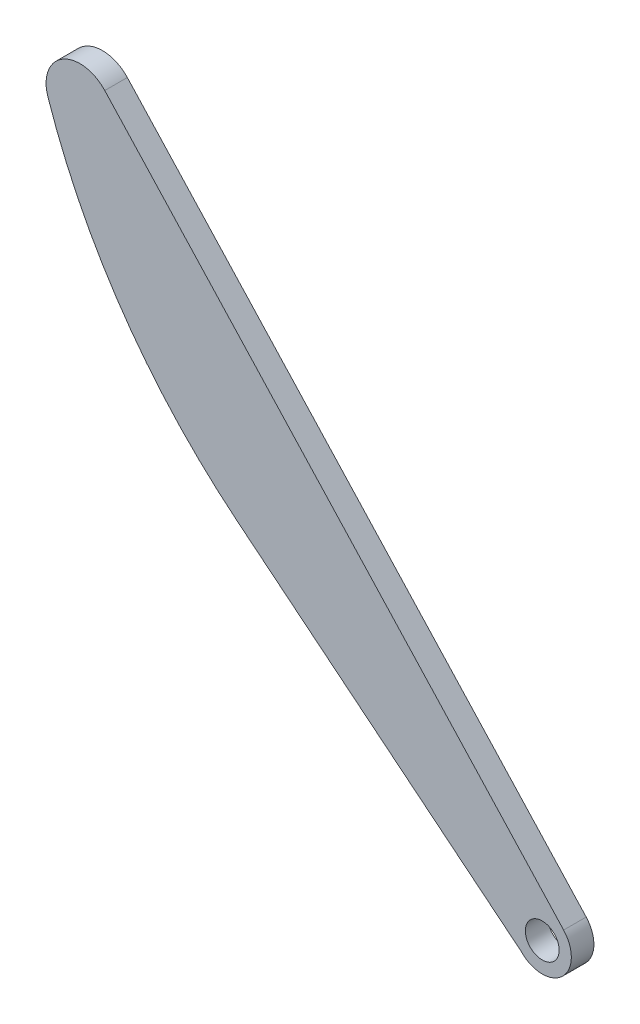
ISO-10303-21;
HEADER;
FILE_DESCRIPTION(('STEP AP214'),'2;1');
FILE_NAME('part.step','',(''),(''),'','','');
FILE_SCHEMA(('AUTOMOTIVE_DESIGN { 1 0 10303 214 1 1 1 1 }'));
ENDSEC;
DATA;
#1=APPLICATION_CONTEXT('core data for automotive mechanical design processes');
#2=APPLICATION_PROTOCOL_DEFINITION('international standard','automotive_design',2000,#1);
#3=PRODUCT_CONTEXT('',#1,'mechanical');
#4=PRODUCT('Part','Part','',(#3));
#5=PRODUCT_RELATED_PRODUCT_CATEGORY('part','',(#4));
#6=PRODUCT_DEFINITION_FORMATION('','',#4);
#7=PRODUCT_DEFINITION_CONTEXT('part definition',#1,'design');
#8=PRODUCT_DEFINITION('design','',#6,#7);
#9=PRODUCT_DEFINITION_SHAPE('','',#8);
#10=(LENGTH_UNIT() NAMED_UNIT(*) SI_UNIT(.MILLI.,.METRE.));
#11=(NAMED_UNIT(*) PLANE_ANGLE_UNIT() SI_UNIT($,.RADIAN.));
#12=(NAMED_UNIT(*) SI_UNIT($,.STERADIAN.) SOLID_ANGLE_UNIT());
#13=UNCERTAINTY_MEASURE_WITH_UNIT(LENGTH_MEASURE(1.E-05),#10,'distance_accuracy_value','');
#14=(GEOMETRIC_REPRESENTATION_CONTEXT(3) GLOBAL_UNCERTAINTY_ASSIGNED_CONTEXT((#13)) GLOBAL_UNIT_ASSIGNED_CONTEXT((#10,
#11,#12)) REPRESENTATION_CONTEXT('',''));
#15=CARTESIAN_POINT('',(0.,0.,0.));
#16=DIRECTION('',(0.,0.,1.));
#17=DIRECTION('',(1.,0.,0.));
#18=AXIS2_PLACEMENT_3D('',#15,#16,#17);
#19=CARTESIAN_POINT('',(-48.5332208546725,41.0400618771236,2.));
#20=DIRECTION('',(0.,0.,1.));
#21=DIRECTION('',(1.,0.,0.));
#22=AXIS2_PLACEMENT_3D('',#19,#20,#21);
#23=PLANE('',#22);
#24=DIRECTION('',(-0.677892334416377,0.735161195207905,0.));
#25=VECTOR('',#24,1.);
#26=CARTESIAN_POINT('',(-46.6365091619035,42.7890202355179,2.));
#27=LINE('',#26,#25);
#28=CARTESIAN_POINT('',(-46.6365091619035,42.7890202355179,2.));
#29=VERTEX_POINT('',#28);
#30=CARTESIAN_POINT('',(-87.3297225084332,86.9200272433503,2.));
#31=VERTEX_POINT('',#30);
#32=EDGE_CURVE('E77',#29,#31,#27,.T.);
#33=ORIENTED_EDGE('',*,*,#32,.T.);
#34=CARTESIAN_POINT('',(-89.5352060940568,84.8863502401013,2.));
#35=DIRECTION('',(0.,0.,1.));
#36=DIRECTION('',(1.,0.,0.));
#37=AXIS2_PLACEMENT_3D('',#34,#35,#36);
#38=CIRCLE('',#37,3.);
#39=CARTESIAN_POINT('',(-92.3780007129024,83.9279563987903,2.));
#40=VERTEX_POINT('',#39);
#41=EDGE_CURVE('E11',#31,#40,#38,.T.);
#42=ORIENTED_EDGE('',*,*,#41,.T.);
#43=CARTESIAN_POINT('',(-42.1319830020141,100.867440385879,2.));
#44=DIRECTION('',(0.,0.,1.));
#45=DIRECTION('',(-1.,0.,0.));
#46=AXIS2_PLACEMENT_3D('',#43,#44,#45);
#47=CIRCLE('',#46,53.0246019650477);
#48=CARTESIAN_POINT('',(-75.5667216166516,59.712529775812,2.));
#49=VERTEX_POINT('',#48);
#50=EDGE_CURVE('E85',#40,#49,#47,.T.);
#51=ORIENTED_EDGE('',*,*,#50,.T.);
#52=DIRECTION('',(0.776147469003071,-0.630551430384649,0.));
#53=VECTOR('',#52,1.);
#54=CARTESIAN_POINT('',(-50.4299325474415,39.2911035187292,2.));
#55=LINE('',#54,#53);
#56=CARTESIAN_POINT('',(-50.4299325474415,39.2911035187292,2.));
#57=VERTEX_POINT('',#56);
#58=EDGE_CURVE('E91',#49,#57,#55,.T.);
#59=ORIENTED_EDGE('',*,*,#58,.T.);
#60=CARTESIAN_POINT('',(-48.5332208546725,41.0400618771236,2.));
#61=DIRECTION('',(0.,0.,1.));
#62=DIRECTION('',(1.,0.,0.));
#63=AXIS2_PLACEMENT_3D('',#60,#61,#62);
#64=CIRCLE('',#63,2.57999429938985);
#65=EDGE_CURVE('E86',#57,#29,#64,.T.);
#66=ORIENTED_EDGE('',*,*,#65,.T.);
#67=EDGE_LOOP('',(#33,#42,#51,#59,#66));
#68=FACE_BOUND('',#67,.T.);
#69=CARTESIAN_POINT('',(-48.5332208546725,41.0400618771236,2.));
#70=DIRECTION('',(0.,0.,1.));
#71=DIRECTION('',(1.,0.,0.));
#72=AXIS2_PLACEMENT_3D('',#69,#70,#71);
#73=CIRCLE('',#72,1.5);
#74=CARTESIAN_POINT('',(-47.0332208546725,41.0400618771236,2.));
#75=VERTEX_POINT('',#74);
#76=EDGE_CURVE('E117',#75,#75,#73,.T.);
#77=ORIENTED_EDGE('',*,*,#76,.F.);
#78=EDGE_LOOP('',(#77));
#79=FACE_BOUND('',#78,.T.);
#80=ADVANCED_FACE('F34',(#68,#79),#23,.T.);
#81=CARTESIAN_POINT('',(-48.5332208546725,41.0400618771236,0.));
#82=DIRECTION('',(0.,0.,1.));
#83=DIRECTION('',(1.,0.,0.));
#84=AXIS2_PLACEMENT_3D('',#81,#82,#83);
#85=PLANE('',#84);
#86=CARTESIAN_POINT('',(-42.1319830020141,100.867440385879,0.));
#87=DIRECTION('',(0.,0.,1.));
#88=DIRECTION('',(-1.,0.,0.));
#89=AXIS2_PLACEMENT_3D('',#86,#87,#88);
#90=CIRCLE('',#89,53.0246019650477);
#91=CARTESIAN_POINT('',(-92.3780007129024,83.9279563987903,0.));
#92=VERTEX_POINT('',#91);
#93=CARTESIAN_POINT('',(-75.5667216166516,59.712529775812,0.));
#94=VERTEX_POINT('',#93);
#95=EDGE_CURVE('E112',#92,#94,#90,.T.);
#96=ORIENTED_EDGE('',*,*,#95,.F.);
#97=CARTESIAN_POINT('',(-89.5352060940568,84.8863502401013,0.));
#98=DIRECTION('',(0.,0.,1.));
#99=DIRECTION('',(1.,0.,0.));
#100=AXIS2_PLACEMENT_3D('',#97,#98,#99);
#101=CIRCLE('',#100,3.);
#102=CARTESIAN_POINT('',(-87.3297225084331,86.9200272433504,0.));
#103=VERTEX_POINT('',#102);
#104=EDGE_CURVE('E56',#92,#103,#101,.F.);
#105=ORIENTED_EDGE('',*,*,#104,.T.);
#106=DIRECTION('',(-0.677892334416376,0.735161195207906,0.));
#107=VECTOR('',#106,1.);
#108=CARTESIAN_POINT('',(-86.5228554394351,86.0449954297378,0.));
#109=LINE('',#108,#107);
#110=CARTESIAN_POINT('',(-46.6365091619035,42.7890202355179,0.));
#111=VERTEX_POINT('',#110);
#112=EDGE_CURVE('E114',#111,#103,#109,.T.);
#113=ORIENTED_EDGE('',*,*,#112,.F.);
#114=CARTESIAN_POINT('',(-48.5332208546725,41.0400618771236,0.));
#115=DIRECTION('',(0.,0.,1.));
#116=DIRECTION('',(1.,0.,0.));
#117=AXIS2_PLACEMENT_3D('',#114,#115,#116);
#118=CIRCLE('',#117,2.57999429938985);
#119=CARTESIAN_POINT('',(-50.4299325474415,39.2911035187292,0.));
#120=VERTEX_POINT('',#119);
#121=EDGE_CURVE('E99',#120,#111,#118,.T.);
#122=ORIENTED_EDGE('',*,*,#121,.F.);
#123=DIRECTION('',(0.776147469003071,-0.630551430384649,0.));
#124=VECTOR('',#123,1.);
#125=CARTESIAN_POINT('',(-50.4299325474415,39.2911035187292,0.));
#126=LINE('',#125,#124);
#127=EDGE_CURVE('E95',#94,#120,#126,.T.);
#128=ORIENTED_EDGE('',*,*,#127,.F.);
#129=EDGE_LOOP('',(#96,#105,#113,#122,#128));
#130=FACE_BOUND('',#129,.T.);
#131=CARTESIAN_POINT('',(-48.5332208546725,41.0400618771236,0.));
#132=DIRECTION('',(0.,0.,1.));
#133=DIRECTION('',(1.,0.,0.));
#134=AXIS2_PLACEMENT_3D('',#131,#132,#133);
#135=CIRCLE('',#134,1.5);
#136=CARTESIAN_POINT('',(-47.0332208546725,41.0400618771236,0.));
#137=VERTEX_POINT('',#136);
#138=EDGE_CURVE('E120',#137,#137,#135,.T.);
#139=ORIENTED_EDGE('',*,*,#138,.T.);
#140=EDGE_LOOP('',(#139));
#141=FACE_BOUND('',#140,.T.);
#142=ADVANCED_FACE('F129',(#130,#141),#85,.F.);
#143=CARTESIAN_POINT('',(-48.5332208546725,41.0400618771236,2.));
#144=DIRECTION('',(0.,0.,-1.));
#145=DIRECTION('',(-1.,0.,0.));
#146=AXIS2_PLACEMENT_3D('',#143,#144,#145);
#147=CYLINDRICAL_SURFACE('',#146,2.57999429938985);
#148=ORIENTED_EDGE('',*,*,#121,.T.);
#149=DIRECTION('',(0.,0.,-1.));
#150=VECTOR('',#149,1.);
#151=CARTESIAN_POINT('',(-46.6365091619035,42.7890202355179,2.));
#152=LINE('',#151,#150);
#153=EDGE_CURVE('E81',#29,#111,#152,.T.);
#154=ORIENTED_EDGE('',*,*,#153,.F.);
#155=ORIENTED_EDGE('',*,*,#65,.F.);
#156=DIRECTION('',(0.,0.,-1.));
#157=VECTOR('',#156,1.);
#158=CARTESIAN_POINT('',(-50.4299325474415,39.2911035187292,2.));
#159=LINE('',#158,#157);
#160=EDGE_CURVE('E106',#57,#120,#159,.T.);
#161=ORIENTED_EDGE('',*,*,#160,.T.);
#162=EDGE_LOOP('',(#148,#154,#155,#161));
#163=FACE_BOUND('',#162,.T.);
#164=ADVANCED_FACE('F97',(#163),#147,.T.);
#165=CARTESIAN_POINT('',(-86.5228554394351,86.0449954297378,2.));
#166=DIRECTION('',(-0.735161195207906,-0.677892334416376,0.));
#167=DIRECTION('',(0.677892334416376,-0.735161195207906,0.));
#168=AXIS2_PLACEMENT_3D('',#165,#166,#167);
#169=PLANE('',#168);
#170=ORIENTED_EDGE('',*,*,#112,.T.);
#171=DIRECTION('',(0.,0.,-1.));
#172=VECTOR('',#171,1.);
#173=CARTESIAN_POINT('',(-87.3297225084331,86.9200272433504,2.));
#174=LINE('',#173,#172);
#175=EDGE_CURVE('E42',#103,#31,#174,.F.);
#176=ORIENTED_EDGE('',*,*,#175,.T.);
#177=ORIENTED_EDGE('',*,*,#32,.F.);
#178=ORIENTED_EDGE('',*,*,#153,.T.);
#179=EDGE_LOOP('',(#170,#176,#177,#178));
#180=FACE_BOUND('',#179,.T.);
#181=ADVANCED_FACE('F79',(#180),#169,.F.);
#182=CARTESIAN_POINT('',(-42.1319830020141,100.867440385879,2.));
#183=DIRECTION('',(0.,0.,-1.));
#184=DIRECTION('',(-1.,0.,0.));
#185=AXIS2_PLACEMENT_3D('',#182,#183,#184);
#186=CYLINDRICAL_SURFACE('',#185,53.0246019650477);
#187=ORIENTED_EDGE('',*,*,#50,.F.);
#188=DIRECTION('',(0.,0.,-1.));
#189=VECTOR('',#188,1.);
#190=CARTESIAN_POINT('',(-92.3780007129024,83.9279563987903,2.));
#191=LINE('',#190,#189);
#192=EDGE_CURVE('E100',#40,#92,#191,.T.);
#193=ORIENTED_EDGE('',*,*,#192,.T.);
#194=ORIENTED_EDGE('',*,*,#95,.T.);
#195=DIRECTION('',(0.,0.,-1.));
#196=VECTOR('',#195,1.);
#197=CARTESIAN_POINT('',(-75.5667216166516,59.712529775812,2.));
#198=LINE('',#197,#196);
#199=EDGE_CURVE('E101',#49,#94,#198,.T.);
#200=ORIENTED_EDGE('',*,*,#199,.F.);
#201=EDGE_LOOP('',(#187,#193,#194,#200));
#202=FACE_BOUND('',#201,.T.);
#203=ADVANCED_FACE('F140',(#202),#186,.T.);
#204=CARTESIAN_POINT('',(-50.4299325474415,39.2911035187292,2.));
#205=DIRECTION('',(0.630551430384649,0.776147469003071,0.));
#206=DIRECTION('',(-0.776147469003071,0.630551430384649,0.));
#207=AXIS2_PLACEMENT_3D('',#204,#205,#206);
#208=PLANE('',#207);
#209=ORIENTED_EDGE('',*,*,#127,.T.);
#210=ORIENTED_EDGE('',*,*,#160,.F.);
#211=ORIENTED_EDGE('',*,*,#58,.F.);
#212=ORIENTED_EDGE('',*,*,#199,.T.);
#213=EDGE_LOOP('',(#209,#210,#211,#212));
#214=FACE_BOUND('',#213,.T.);
#215=ADVANCED_FACE('F137',(#214),#208,.F.);
#216=CARTESIAN_POINT('',(-48.5332208546725,41.0400618771236,2.));
#217=DIRECTION('',(0.,0.,-1.));
#218=DIRECTION('',(-1.,0.,0.));
#219=AXIS2_PLACEMENT_3D('',#216,#217,#218);
#220=CYLINDRICAL_SURFACE('',#219,1.5);
#221=ORIENTED_EDGE('',*,*,#76,.T.);
#222=EDGE_LOOP('',(#221));
#223=FACE_BOUND('',#222,.T.);
#224=ORIENTED_EDGE('',*,*,#138,.F.);
#225=EDGE_LOOP('',(#224));
#226=FACE_BOUND('',#225,.T.);
#227=ADVANCED_FACE('F126',(#223,#226),#220,.F.);
#228=CARTESIAN_POINT('',(-89.5352060940568,84.8863502401013,2.));
#229=DIRECTION('',(0.,0.,-1.));
#230=DIRECTION('',(-1.,0.,0.));
#231=AXIS2_PLACEMENT_3D('',#228,#229,#230);
#232=CYLINDRICAL_SURFACE('',#231,3.);
#233=ORIENTED_EDGE('',*,*,#41,.F.);
#234=ORIENTED_EDGE('',*,*,#175,.F.);
#235=ORIENTED_EDGE('',*,*,#104,.F.);
#236=ORIENTED_EDGE('',*,*,#192,.F.);
#237=EDGE_LOOP('',(#233,#234,#235,#236));
#238=FACE_BOUND('',#237,.T.);
#239=ADVANCED_FACE('F36',(#238),#232,.T.);
#240=CLOSED_SHELL('',(#80,#142,#164,#181,#203,#215,#227,#239));
#241=MANIFOLD_SOLID_BREP('B2',#240);
#242=ADVANCED_BREP_SHAPE_REPRESENTATION('',(#18,#241),#14);
#243=SHAPE_DEFINITION_REPRESENTATION(#9,#242);
ENDSEC;
END-ISO-10303-21;
